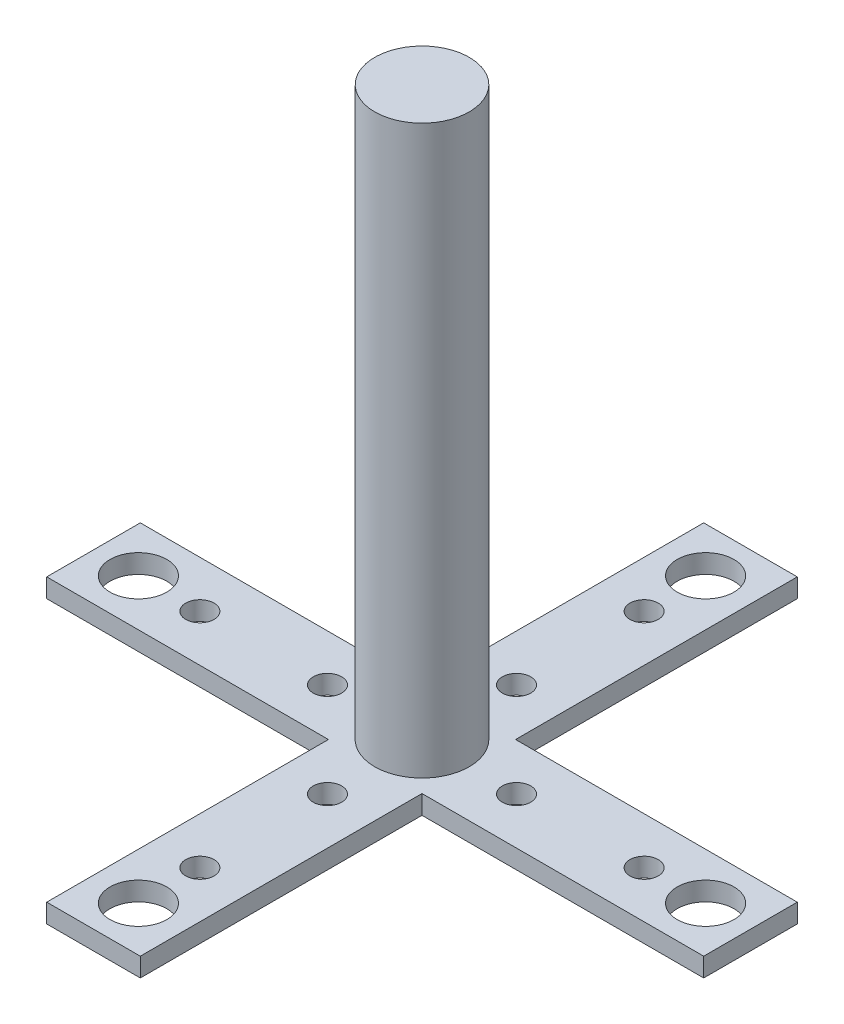
ISO-10303-21;
HEADER;
FILE_DESCRIPTION(('STEP AP214'),'2;1');
FILE_NAME('part.step','',(''),(''),'','','');
FILE_SCHEMA(('AUTOMOTIVE_DESIGN { 1 0 10303 214 1 1 1 1 }'));
ENDSEC;
DATA;
#1=APPLICATION_CONTEXT('core data for automotive mechanical design processes');
#2=APPLICATION_PROTOCOL_DEFINITION('international standard','automotive_design',2000,#1);
#3=PRODUCT_CONTEXT('',#1,'mechanical');
#4=PRODUCT('Part','Part','',(#3));
#5=PRODUCT_RELATED_PRODUCT_CATEGORY('part','',(#4));
#6=PRODUCT_DEFINITION_FORMATION('','',#4);
#7=PRODUCT_DEFINITION_CONTEXT('part definition',#1,'design');
#8=PRODUCT_DEFINITION('design','',#6,#7);
#9=PRODUCT_DEFINITION_SHAPE('','',#8);
#10=(LENGTH_UNIT() NAMED_UNIT(*) SI_UNIT(.MILLI.,.METRE.));
#11=(NAMED_UNIT(*) PLANE_ANGLE_UNIT() SI_UNIT($,.RADIAN.));
#12=(NAMED_UNIT(*) SI_UNIT($,.STERADIAN.) SOLID_ANGLE_UNIT());
#13=UNCERTAINTY_MEASURE_WITH_UNIT(LENGTH_MEASURE(1.E-05),#10,'distance_accuracy_value','');
#14=(GEOMETRIC_REPRESENTATION_CONTEXT(3) GLOBAL_UNCERTAINTY_ASSIGNED_CONTEXT((#13)) GLOBAL_UNIT_ASSIGNED_CONTEXT((#10,
#11,#12)) REPRESENTATION_CONTEXT('',''));
#15=CARTESIAN_POINT('',(0.,0.,0.));
#16=DIRECTION('',(0.,0.,1.));
#17=DIRECTION('',(1.,0.,0.));
#18=AXIS2_PLACEMENT_3D('',#15,#16,#17);
#19=CARTESIAN_POINT('',(0.,0.,0.));
#20=DIRECTION('',(0.,1.,0.));
#21=DIRECTION('',(0.,0.,1.));
#22=AXIS2_PLACEMENT_3D('',#19,#20,#21);
#23=PLANE('',#22);
#24=CARTESIAN_POINT('',(0.,0.,-30.));
#25=DIRECTION('',(0.,-1.,0.));
#26=DIRECTION('',(0.,0.,-1.));
#27=AXIS2_PLACEMENT_3D('',#24,#25,#26);
#28=CIRCLE('',#27,3.);
#29=CARTESIAN_POINT('',(0.,0.,-33.));
#30=VERTEX_POINT('',#29);
#31=EDGE_CURVE('E355',#30,#30,#28,.T.);
#32=ORIENTED_EDGE('',*,*,#31,.F.);
#33=EDGE_LOOP('',(#32));
#34=FACE_BOUND('',#33,.T.);
#35=CARTESIAN_POINT('',(-30.,0.,1.02142354951329E-13));
#36=DIRECTION('',(0.,-1.,0.));
#37=DIRECTION('',(0.,0.,-1.));
#38=AXIS2_PLACEMENT_3D('',#35,#36,#37);
#39=CIRCLE('',#38,3.);
#40=CARTESIAN_POINT('',(-30.,0.,-2.9999999999999));
#41=VERTEX_POINT('',#40);
#42=EDGE_CURVE('E626',#41,#41,#39,.T.);
#43=ORIENTED_EDGE('',*,*,#42,.F.);
#44=EDGE_LOOP('',(#43));
#45=FACE_BOUND('',#44,.T.);
#46=CARTESIAN_POINT('',(2.06886795116623E-13,0.,30.));
#47=DIRECTION('',(0.,-1.,0.));
#48=DIRECTION('',(0.,0.,-1.));
#49=AXIS2_PLACEMENT_3D('',#46,#47,#48);
#50=CIRCLE('',#49,3.);
#51=CARTESIAN_POINT('',(2.06886795116623E-13,0.,27.));
#52=VERTEX_POINT('',#51);
#53=EDGE_CURVE('E630',#52,#52,#50,.T.);
#54=ORIENTED_EDGE('',*,*,#53,.F.);
#55=EDGE_LOOP('',(#54));
#56=FACE_BOUND('',#55,.T.);
#57=CARTESIAN_POINT('',(30.,0.,-3.11631235281917E-13));
#58=DIRECTION('',(0.,-1.,0.));
#59=DIRECTION('',(0.,0.,-1.));
#60=AXIS2_PLACEMENT_3D('',#57,#58,#59);
#61=CIRCLE('',#60,3.);
#62=CARTESIAN_POINT('',(30.,0.,-3.00000000000031));
#63=VERTEX_POINT('',#62);
#64=EDGE_CURVE('E634',#63,#63,#61,.T.);
#65=ORIENTED_EDGE('',*,*,#64,.F.);
#66=EDGE_LOOP('',(#65));
#67=FACE_BOUND('',#66,.T.);
#68=CARTESIAN_POINT('',(-23.5,0.,-2.49454658759419E-13));
#69=DIRECTION('',(0.,1.,0.));
#70=DIRECTION('',(0.,0.,1.));
#71=AXIS2_PLACEMENT_3D('',#68,#69,#70);
#72=CIRCLE('',#71,1.5);
#73=CARTESIAN_POINT('',(-23.5,0.,1.49999999999975));
#74=VERTEX_POINT('',#73);
#75=EDGE_CURVE('E316',#74,#74,#72,.T.);
#76=ORIENTED_EDGE('',*,*,#75,.T.);
#77=EDGE_LOOP('',(#76));
#78=FACE_BOUND('',#77,.T.);
#79=CARTESIAN_POINT('',(-9.99999999997669,0.,1.4106110275037E-11));
#80=DIRECTION('',(0.,1.,0.));
#81=DIRECTION('',(0.,0.,1.));
#82=AXIS2_PLACEMENT_3D('',#79,#80,#81);
#83=CIRCLE('',#82,1.5);
#84=CARTESIAN_POINT('',(-9.99999999997669,0.,1.50000000001411));
#85=VERTEX_POINT('',#84);
#86=EDGE_CURVE('E312',#85,#85,#83,.T.);
#87=ORIENTED_EDGE('',*,*,#86,.T.);
#88=EDGE_LOOP('',(#87));
#89=FACE_BOUND('',#88,.T.);
#90=CARTESIAN_POINT('',(-1.67404847296605E-13,0.,23.5));
#91=DIRECTION('',(0.,1.,0.));
#92=DIRECTION('',(0.,0.,1.));
#93=AXIS2_PLACEMENT_3D('',#90,#91,#92);
#94=CIRCLE('',#93,1.5);
#95=CARTESIAN_POINT('',(-1.67404847296605E-13,0.,25.));
#96=VERTEX_POINT('',#95);
#97=EDGE_CURVE('E308',#96,#96,#94,.T.);
#98=ORIENTED_EDGE('',*,*,#97,.T.);
#99=EDGE_LOOP('',(#98));
#100=FACE_BOUND('',#99,.T.);
#101=CARTESIAN_POINT('',(1.41410250884253E-11,0.,9.99999999997669));
#102=DIRECTION('',(0.,1.,0.));
#103=DIRECTION('',(0.,0.,1.));
#104=AXIS2_PLACEMENT_3D('',#101,#102,#103);
#105=CIRCLE('',#104,1.5);
#106=CARTESIAN_POINT('',(1.41410250884253E-11,0.,11.4999999999767));
#107=VERTEX_POINT('',#106);
#108=EDGE_CURVE('E304',#107,#107,#105,.T.);
#109=ORIENTED_EDGE('',*,*,#108,.T.);
#110=EDGE_LOOP('',(#109));
#111=FACE_BOUND('',#110,.T.);
#112=CARTESIAN_POINT('',(-1.4210854715202E-11,0.,-9.99999999997669));
#113=DIRECTION('',(0.,1.,0.));
#114=DIRECTION('',(0.,0.,1.));
#115=AXIS2_PLACEMENT_3D('',#112,#113,#114);
#116=CIRCLE('',#115,1.5);
#117=CARTESIAN_POINT('',(-1.4210854715202E-11,0.,-8.49999999997669));
#118=VERTEX_POINT('',#117);
#119=EDGE_CURVE('E300',#118,#118,#116,.T.);
#120=ORIENTED_EDGE('',*,*,#119,.T.);
#121=EDGE_LOOP('',(#120));
#122=FACE_BOUND('',#121,.T.);
#123=CARTESIAN_POINT('',(0.,0.,-23.5));
#124=DIRECTION('',(0.,1.,0.));
#125=DIRECTION('',(0.,0.,1.));
#126=AXIS2_PLACEMENT_3D('',#123,#124,#125);
#127=CIRCLE('',#126,1.5);
#128=CARTESIAN_POINT('',(0.,0.,-22.));
#129=VERTEX_POINT('',#128);
#130=EDGE_CURVE('E296',#129,#129,#127,.T.);
#131=ORIENTED_EDGE('',*,*,#130,.T.);
#132=EDGE_LOOP('',(#131));
#133=FACE_BOUND('',#132,.T.);
#134=CARTESIAN_POINT('',(23.5,0.,0.));
#135=DIRECTION('',(0.,1.,0.));
#136=DIRECTION('',(0.,0.,1.));
#137=AXIS2_PLACEMENT_3D('',#134,#135,#136);
#138=CIRCLE('',#137,1.5);
#139=CARTESIAN_POINT('',(23.5,0.,1.50000000000009));
#140=VERTEX_POINT('',#139);
#141=EDGE_CURVE('E292',#140,#140,#138,.T.);
#142=ORIENTED_EDGE('',*,*,#141,.T.);
#143=EDGE_LOOP('',(#142));
#144=FACE_BOUND('',#143,.T.);
#145=CARTESIAN_POINT('',(9.99999999997669,0.,-1.41759399018137E-11));
#146=DIRECTION('',(0.,1.,0.));
#147=DIRECTION('',(0.,0.,1.));
#148=AXIS2_PLACEMENT_3D('',#145,#146,#147);
#149=CIRCLE('',#148,1.5);
#150=CARTESIAN_POINT('',(9.99999999997669,0.,1.49999999998582));
#151=VERTEX_POINT('',#150);
#152=EDGE_CURVE('E288',#151,#151,#149,.T.);
#153=ORIENTED_EDGE('',*,*,#152,.T.);
#154=EDGE_LOOP('',(#153));
#155=FACE_BOUND('',#154,.T.);
#156=DIRECTION('',(0.,0.,-1.));
#157=VECTOR('',#156,1.);
#158=CARTESIAN_POINT('',(-4.94999999999999,0.,0.));
#159=LINE('',#158,#157);
#160=CARTESIAN_POINT('',(-4.94999999999999,0.,-4.95));
#161=VERTEX_POINT('',#160);
#162=CARTESIAN_POINT('',(-4.94999999999999,0.,-34.75));
#163=VERTEX_POINT('',#162);
#164=EDGE_CURVE('E243',#161,#163,#159,.T.);
#165=ORIENTED_EDGE('',*,*,#164,.T.);
#166=DIRECTION('',(1.,0.,0.));
#167=VECTOR('',#166,1.);
#168=CARTESIAN_POINT('',(0.,0.,-34.75));
#169=LINE('',#168,#167);
#170=CARTESIAN_POINT('',(4.95000000000001,0.,-34.75));
#171=VERTEX_POINT('',#170);
#172=EDGE_CURVE('E284',#163,#171,#169,.T.);
#173=ORIENTED_EDGE('',*,*,#172,.T.);
#174=DIRECTION('',(0.,0.,-1.));
#175=VECTOR('',#174,1.);
#176=CARTESIAN_POINT('',(4.95000000000001,0.,0.));
#177=LINE('',#176,#175);
#178=CARTESIAN_POINT('',(4.95000000000001,0.,-4.95));
#179=VERTEX_POINT('',#178);
#180=EDGE_CURVE('E281',#179,#171,#177,.T.);
#181=ORIENTED_EDGE('',*,*,#180,.F.);
#182=DIRECTION('',(1.,0.,0.));
#183=VECTOR('',#182,1.);
#184=CARTESIAN_POINT('',(0.,0.,-4.95));
#185=LINE('',#184,#183);
#186=CARTESIAN_POINT('',(34.75,0.,-4.95));
#187=VERTEX_POINT('',#186);
#188=EDGE_CURVE('E184',#179,#187,#185,.T.);
#189=ORIENTED_EDGE('',*,*,#188,.T.);
#190=DIRECTION('',(0.,0.,-1.));
#191=VECTOR('',#190,1.);
#192=CARTESIAN_POINT('',(34.75,0.,0.));
#193=LINE('',#192,#191);
#194=CARTESIAN_POINT('',(34.75,0.,4.95));
#195=VERTEX_POINT('',#194);
#196=EDGE_CURVE('E275',#195,#187,#193,.T.);
#197=ORIENTED_EDGE('',*,*,#196,.F.);
#198=DIRECTION('',(1.,0.,0.));
#199=VECTOR('',#198,1.);
#200=CARTESIAN_POINT('',(0.,0.,4.95));
#201=LINE('',#200,#199);
#202=CARTESIAN_POINT('',(4.95000000000001,0.,4.95));
#203=VERTEX_POINT('',#202);
#204=EDGE_CURVE('E271',#203,#195,#201,.T.);
#205=ORIENTED_EDGE('',*,*,#204,.F.);
#206=DIRECTION('',(0.,0.,-1.));
#207=VECTOR('',#206,1.);
#208=CARTESIAN_POINT('',(4.95000000000001,0.,0.));
#209=LINE('',#208,#207);
#210=CARTESIAN_POINT('',(4.95000000000001,0.,34.75));
#211=VERTEX_POINT('',#210);
#212=EDGE_CURVE('E267',#211,#203,#209,.T.);
#213=ORIENTED_EDGE('',*,*,#212,.F.);
#214=DIRECTION('',(1.,0.,0.));
#215=VECTOR('',#214,1.);
#216=CARTESIAN_POINT('',(0.,0.,34.75));
#217=LINE('',#216,#215);
#218=CARTESIAN_POINT('',(-4.94999999999999,0.,34.75));
#219=VERTEX_POINT('',#218);
#220=EDGE_CURVE('E263',#219,#211,#217,.T.);
#221=ORIENTED_EDGE('',*,*,#220,.F.);
#222=DIRECTION('',(0.,0.,-1.));
#223=VECTOR('',#222,1.);
#224=CARTESIAN_POINT('',(-4.94999999999999,0.,0.));
#225=LINE('',#224,#223);
#226=CARTESIAN_POINT('',(-4.94999999999999,0.,4.95));
#227=VERTEX_POINT('',#226);
#228=EDGE_CURVE('E259',#219,#227,#225,.T.);
#229=ORIENTED_EDGE('',*,*,#228,.T.);
#230=DIRECTION('',(1.,0.,0.));
#231=VECTOR('',#230,1.);
#232=CARTESIAN_POINT('',(0.,0.,4.95));
#233=LINE('',#232,#231);
#234=CARTESIAN_POINT('',(-34.75,0.,4.95));
#235=VERTEX_POINT('',#234);
#236=EDGE_CURVE('E255',#235,#227,#233,.T.);
#237=ORIENTED_EDGE('',*,*,#236,.F.);
#238=DIRECTION('',(0.,0.,-1.));
#239=VECTOR('',#238,1.);
#240=CARTESIAN_POINT('',(-34.75,0.,0.));
#241=LINE('',#240,#239);
#242=CARTESIAN_POINT('',(-34.75,0.,-4.95));
#243=VERTEX_POINT('',#242);
#244=EDGE_CURVE('E251',#235,#243,#241,.T.);
#245=ORIENTED_EDGE('',*,*,#244,.T.);
#246=DIRECTION('',(1.,0.,0.));
#247=VECTOR('',#246,1.);
#248=CARTESIAN_POINT('',(0.,0.,-4.95));
#249=LINE('',#248,#247);
#250=EDGE_CURVE('E246',#243,#161,#249,.T.);
#251=ORIENTED_EDGE('',*,*,#250,.T.);
#252=EDGE_LOOP('',(#165,#173,#181,#189,#197,#205,#213,#221,#229,#237,#245,#251));
#253=FACE_BOUND('',#252,.T.);
#254=ADVANCED_FACE('F83',(#34,#45,#56,#67,#78,#89,#100,#111,#122,#133,#144,#155,#253),#23,.F.);
#255=CARTESIAN_POINT('',(0.,2.,0.));
#256=DIRECTION('',(0.,1.,0.));
#257=DIRECTION('',(0.,0.,1.));
#258=AXIS2_PLACEMENT_3D('',#255,#256,#257);
#259=PLANE('',#258);
#260=CARTESIAN_POINT('',(0.,2.,-30.));
#261=DIRECTION('',(0.,1.,0.));
#262=DIRECTION('',(0.,0.,1.));
#263=AXIS2_PLACEMENT_3D('',#260,#261,#262);
#264=CIRCLE('',#263,3.);
#265=CARTESIAN_POINT('',(0.,2.,-27.));
#266=VERTEX_POINT('',#265);
#267=EDGE_CURVE('E87',#266,#266,#264,.T.);
#268=ORIENTED_EDGE('',*,*,#267,.F.);
#269=EDGE_LOOP('',(#268));
#270=FACE_BOUND('',#269,.T.);
#271=CARTESIAN_POINT('',(-30.,2.,1.02142354951329E-13));
#272=DIRECTION('',(0.,1.,0.));
#273=DIRECTION('',(0.,0.,1.));
#274=AXIS2_PLACEMENT_3D('',#271,#272,#273);
#275=CIRCLE('',#274,3.);
#276=CARTESIAN_POINT('',(-30.,2.,3.0000000000001));
#277=VERTEX_POINT('',#276);
#278=EDGE_CURVE('E358',#277,#277,#275,.T.);
#279=ORIENTED_EDGE('',*,*,#278,.F.);
#280=EDGE_LOOP('',(#279));
#281=FACE_BOUND('',#280,.T.);
#282=CARTESIAN_POINT('',(2.06886795116623E-13,2.,30.));
#283=DIRECTION('',(0.,1.,0.));
#284=DIRECTION('',(0.,0.,1.));
#285=AXIS2_PLACEMENT_3D('',#282,#283,#284);
#286=CIRCLE('',#285,3.);
#287=CARTESIAN_POINT('',(2.06886795116623E-13,2.,33.));
#288=VERTEX_POINT('',#287);
#289=EDGE_CURVE('E354',#288,#288,#286,.T.);
#290=ORIENTED_EDGE('',*,*,#289,.F.);
#291=EDGE_LOOP('',(#290));
#292=FACE_BOUND('',#291,.T.);
#293=CARTESIAN_POINT('',(30.,2.,-3.11631235281917E-13));
#294=DIRECTION('',(0.,1.,0.));
#295=DIRECTION('',(0.,0.,1.));
#296=AXIS2_PLACEMENT_3D('',#293,#294,#295);
#297=CIRCLE('',#296,3.);
#298=CARTESIAN_POINT('',(30.,2.,2.99999999999969));
#299=VERTEX_POINT('',#298);
#300=EDGE_CURVE('E350',#299,#299,#297,.T.);
#301=ORIENTED_EDGE('',*,*,#300,.F.);
#302=EDGE_LOOP('',(#301));
#303=FACE_BOUND('',#302,.T.);
#304=CARTESIAN_POINT('',(0.,2.,0.));
#305=DIRECTION('',(0.,1.,0.));
#306=DIRECTION('',(0.,0.,1.));
#307=AXIS2_PLACEMENT_3D('',#304,#305,#306);
#308=CIRCLE('',#307,5.);
#309=CARTESIAN_POINT('',(0.,2.,5.));
#310=VERTEX_POINT('',#309);
#311=EDGE_CURVE('E365',#310,#310,#308,.T.);
#312=ORIENTED_EDGE('',*,*,#311,.F.);
#313=EDGE_LOOP('',(#312));
#314=FACE_BOUND('',#313,.T.);
#315=DIRECTION('',(0.,0.,-1.));
#316=VECTOR('',#315,1.);
#317=CARTESIAN_POINT('',(-4.94999999999999,2.,0.));
#318=LINE('',#317,#316);
#319=CARTESIAN_POINT('',(-4.94999999999999,2.,-4.95));
#320=VERTEX_POINT('',#319);
#321=CARTESIAN_POINT('',(-4.94999999999999,2.,-34.75));
#322=VERTEX_POINT('',#321);
#323=EDGE_CURVE('E320',#320,#322,#318,.T.);
#324=ORIENTED_EDGE('',*,*,#323,.F.);
#325=DIRECTION('',(1.,0.,0.));
#326=VECTOR('',#325,1.);
#327=CARTESIAN_POINT('',(0.,2.,-4.95));
#328=LINE('',#327,#326);
#329=CARTESIAN_POINT('',(-34.75,2.,-4.95));
#330=VERTEX_POINT('',#329);
#331=EDGE_CURVE('E380',#330,#320,#328,.T.);
#332=ORIENTED_EDGE('',*,*,#331,.F.);
#333=DIRECTION('',(0.,0.,-1.));
#334=VECTOR('',#333,1.);
#335=CARTESIAN_POINT('',(-34.75,2.,0.));
#336=LINE('',#335,#334);
#337=CARTESIAN_POINT('',(-34.75,2.,4.95));
#338=VERTEX_POINT('',#337);
#339=EDGE_CURVE('E384',#338,#330,#336,.T.);
#340=ORIENTED_EDGE('',*,*,#339,.F.);
#341=DIRECTION('',(1.,0.,0.));
#342=VECTOR('',#341,1.);
#343=CARTESIAN_POINT('',(0.,2.,4.95));
#344=LINE('',#343,#342);
#345=CARTESIAN_POINT('',(-4.94999999999999,2.,4.95));
#346=VERTEX_POINT('',#345);
#347=EDGE_CURVE('E388',#338,#346,#344,.T.);
#348=ORIENTED_EDGE('',*,*,#347,.T.);
#349=DIRECTION('',(0.,0.,-1.));
#350=VECTOR('',#349,1.);
#351=CARTESIAN_POINT('',(-4.94999999999999,2.,0.));
#352=LINE('',#351,#350);
#353=CARTESIAN_POINT('',(-4.94999999999999,2.,34.75));
#354=VERTEX_POINT('',#353);
#355=EDGE_CURVE('E391',#354,#346,#352,.T.);
#356=ORIENTED_EDGE('',*,*,#355,.F.);
#357=DIRECTION('',(1.,0.,0.));
#358=VECTOR('',#357,1.);
#359=CARTESIAN_POINT('',(0.,2.,34.75));
#360=LINE('',#359,#358);
#361=CARTESIAN_POINT('',(4.95000000000001,2.,34.75));
#362=VERTEX_POINT('',#361);
#363=EDGE_CURVE('E395',#354,#362,#360,.T.);
#364=ORIENTED_EDGE('',*,*,#363,.T.);
#365=DIRECTION('',(0.,0.,-1.));
#366=VECTOR('',#365,1.);
#367=CARTESIAN_POINT('',(4.95000000000001,2.,0.));
#368=LINE('',#367,#366);
#369=CARTESIAN_POINT('',(4.95000000000001,2.,4.95));
#370=VERTEX_POINT('',#369);
#371=EDGE_CURVE('E399',#362,#370,#368,.T.);
#372=ORIENTED_EDGE('',*,*,#371,.T.);
#373=DIRECTION('',(1.,0.,0.));
#374=VECTOR('',#373,1.);
#375=CARTESIAN_POINT('',(0.,2.,4.95));
#376=LINE('',#375,#374);
#377=CARTESIAN_POINT('',(34.75,2.,4.95));
#378=VERTEX_POINT('',#377);
#379=EDGE_CURVE('E205',#370,#378,#376,.T.);
#380=ORIENTED_EDGE('',*,*,#379,.T.);
#381=DIRECTION('',(0.,0.,-1.));
#382=VECTOR('',#381,1.);
#383=CARTESIAN_POINT('',(34.75,2.,0.));
#384=LINE('',#383,#382);
#385=CARTESIAN_POINT('',(34.75,2.,-4.95));
#386=VERTEX_POINT('',#385);
#387=EDGE_CURVE('E200',#378,#386,#384,.T.);
#388=ORIENTED_EDGE('',*,*,#387,.T.);
#389=DIRECTION('',(1.,0.,0.));
#390=VECTOR('',#389,1.);
#391=CARTESIAN_POINT('',(0.,2.,-4.95));
#392=LINE('',#391,#390);
#393=CARTESIAN_POINT('',(4.95000000000001,2.,-4.95));
#394=VERTEX_POINT('',#393);
#395=EDGE_CURVE('E182',#394,#386,#392,.T.);
#396=ORIENTED_EDGE('',*,*,#395,.F.);
#397=DIRECTION('',(0.,0.,-1.));
#398=VECTOR('',#397,1.);
#399=CARTESIAN_POINT('',(4.95000000000001,2.,0.));
#400=LINE('',#399,#398);
#401=CARTESIAN_POINT('',(4.95000000000001,2.,-34.75));
#402=VERTEX_POINT('',#401);
#403=EDGE_CURVE('E190',#394,#402,#400,.T.);
#404=ORIENTED_EDGE('',*,*,#403,.T.);
#405=DIRECTION('',(1.,0.,0.));
#406=VECTOR('',#405,1.);
#407=CARTESIAN_POINT('',(0.,2.,-34.75));
#408=LINE('',#407,#406);
#409=EDGE_CURVE('E195',#322,#402,#408,.T.);
#410=ORIENTED_EDGE('',*,*,#409,.F.);
#411=EDGE_LOOP('',(#324,#332,#340,#348,#356,#364,#372,#380,#388,#396,#404,#410));
#412=FACE_BOUND('',#411,.T.);
#413=CARTESIAN_POINT('',(9.99999999997669,2.,-1.41759399018137E-11));
#414=DIRECTION('',(0.,1.,0.));
#415=DIRECTION('',(0.,0.,1.));
#416=AXIS2_PLACEMENT_3D('',#413,#414,#415);
#417=CIRCLE('',#416,1.5);
#418=CARTESIAN_POINT('',(9.99999999997669,2.,1.49999999998582));
#419=VERTEX_POINT('',#418);
#420=EDGE_CURVE('E211',#419,#419,#417,.T.);
#421=ORIENTED_EDGE('',*,*,#420,.F.);
#422=EDGE_LOOP('',(#421));
#423=FACE_BOUND('',#422,.T.);
#424=CARTESIAN_POINT('',(23.5,2.,0.));
#425=DIRECTION('',(0.,1.,0.));
#426=DIRECTION('',(0.,0.,1.));
#427=AXIS2_PLACEMENT_3D('',#424,#425,#426);
#428=CIRCLE('',#427,1.5);
#429=CARTESIAN_POINT('',(23.5,2.,1.50000000000009));
#430=VERTEX_POINT('',#429);
#431=EDGE_CURVE('E215',#430,#430,#428,.T.);
#432=ORIENTED_EDGE('',*,*,#431,.F.);
#433=EDGE_LOOP('',(#432));
#434=FACE_BOUND('',#433,.T.);
#435=CARTESIAN_POINT('',(0.,2.,-23.5));
#436=DIRECTION('',(0.,1.,0.));
#437=DIRECTION('',(0.,0.,1.));
#438=AXIS2_PLACEMENT_3D('',#435,#436,#437);
#439=CIRCLE('',#438,1.5);
#440=CARTESIAN_POINT('',(0.,2.,-22.));
#441=VERTEX_POINT('',#440);
#442=EDGE_CURVE('E219',#441,#441,#439,.T.);
#443=ORIENTED_EDGE('',*,*,#442,.F.);
#444=EDGE_LOOP('',(#443));
#445=FACE_BOUND('',#444,.T.);
#446=CARTESIAN_POINT('',(-1.4210854715202E-11,2.,-9.99999999997669));
#447=DIRECTION('',(0.,1.,0.));
#448=DIRECTION('',(0.,0.,1.));
#449=AXIS2_PLACEMENT_3D('',#446,#447,#448);
#450=CIRCLE('',#449,1.5);
#451=CARTESIAN_POINT('',(-1.4210854715202E-11,2.,-8.49999999997669));
#452=VERTEX_POINT('',#451);
#453=EDGE_CURVE('E223',#452,#452,#450,.T.);
#454=ORIENTED_EDGE('',*,*,#453,.F.);
#455=EDGE_LOOP('',(#454));
#456=FACE_BOUND('',#455,.T.);
#457=CARTESIAN_POINT('',(1.41410250884253E-11,2.,9.99999999997669));
#458=DIRECTION('',(0.,1.,0.));
#459=DIRECTION('',(0.,0.,1.));
#460=AXIS2_PLACEMENT_3D('',#457,#458,#459);
#461=CIRCLE('',#460,1.5);
#462=CARTESIAN_POINT('',(1.41410250884253E-11,2.,11.4999999999767));
#463=VERTEX_POINT('',#462);
#464=EDGE_CURVE('E227',#463,#463,#461,.T.);
#465=ORIENTED_EDGE('',*,*,#464,.F.);
#466=EDGE_LOOP('',(#465));
#467=FACE_BOUND('',#466,.T.);
#468=CARTESIAN_POINT('',(-1.67404847296605E-13,2.,23.5));
#469=DIRECTION('',(0.,1.,0.));
#470=DIRECTION('',(0.,0.,1.));
#471=AXIS2_PLACEMENT_3D('',#468,#469,#470);
#472=CIRCLE('',#471,1.5);
#473=CARTESIAN_POINT('',(-1.67404847296605E-13,2.,25.));
#474=VERTEX_POINT('',#473);
#475=EDGE_CURVE('E231',#474,#474,#472,.T.);
#476=ORIENTED_EDGE('',*,*,#475,.F.);
#477=EDGE_LOOP('',(#476));
#478=FACE_BOUND('',#477,.T.);
#479=CARTESIAN_POINT('',(-9.99999999997669,2.,1.4106110275037E-11));
#480=DIRECTION('',(0.,1.,0.));
#481=DIRECTION('',(0.,0.,1.));
#482=AXIS2_PLACEMENT_3D('',#479,#480,#481);
#483=CIRCLE('',#482,1.5);
#484=CARTESIAN_POINT('',(-9.99999999997669,2.,1.50000000001411));
#485=VERTEX_POINT('',#484);
#486=EDGE_CURVE('E235',#485,#485,#483,.T.);
#487=ORIENTED_EDGE('',*,*,#486,.F.);
#488=EDGE_LOOP('',(#487));
#489=FACE_BOUND('',#488,.T.);
#490=CARTESIAN_POINT('',(-23.5,2.,-2.49454658759419E-13));
#491=DIRECTION('',(0.,1.,0.));
#492=DIRECTION('',(0.,0.,1.));
#493=AXIS2_PLACEMENT_3D('',#490,#491,#492);
#494=CIRCLE('',#493,1.5);
#495=CARTESIAN_POINT('',(-23.5,2.,1.49999999999975));
#496=VERTEX_POINT('',#495);
#497=EDGE_CURVE('E239',#496,#496,#494,.T.);
#498=ORIENTED_EDGE('',*,*,#497,.F.);
#499=EDGE_LOOP('',(#498));
#500=FACE_BOUND('',#499,.T.);
#501=ADVANCED_FACE('F197',(#270,#281,#292,#303,#314,#412,#423,#434,#445,#456,#467,#478,#489,
#500),#259,.T.);
#502=CARTESIAN_POINT('',(0.,2.,-4.95));
#503=DIRECTION('',(0.,0.,-1.));
#504=DIRECTION('',(-1.,0.,0.));
#505=AXIS2_PLACEMENT_3D('',#502,#503,#504);
#506=PLANE('',#505);
#507=ORIENTED_EDGE('',*,*,#250,.F.);
#508=DIRECTION('',(0.,-1.,0.));
#509=VECTOR('',#508,1.);
#510=CARTESIAN_POINT('',(-34.75,2.,-4.95));
#511=LINE('',#510,#509);
#512=EDGE_CURVE('E94',#330,#243,#511,.T.);
#513=ORIENTED_EDGE('',*,*,#512,.F.);
#514=ORIENTED_EDGE('',*,*,#331,.T.);
#515=DIRECTION('',(0.,-1.,0.));
#516=VECTOR('',#515,1.);
#517=CARTESIAN_POINT('',(-4.94999999999999,2.,-4.95));
#518=LINE('',#517,#516);
#519=EDGE_CURVE('E12',#320,#161,#518,.T.);
#520=ORIENTED_EDGE('',*,*,#519,.T.);
#521=EDGE_LOOP('',(#507,#513,#514,#520));
#522=FACE_BOUND('',#521,.T.);
#523=ADVANCED_FACE('F420',(#522),#506,.T.);
#524=CARTESIAN_POINT('',(-34.75,2.,0.));
#525=DIRECTION('',(-1.,0.,0.));
#526=DIRECTION('',(0.,0.,1.));
#527=AXIS2_PLACEMENT_3D('',#524,#525,#526);
#528=PLANE('',#527);
#529=ORIENTED_EDGE('',*,*,#244,.F.);
#530=DIRECTION('',(0.,-1.,0.));
#531=VECTOR('',#530,1.);
#532=CARTESIAN_POINT('',(-34.75,2.,4.95));
#533=LINE('',#532,#531);
#534=EDGE_CURVE('E345',#338,#235,#533,.T.);
#535=ORIENTED_EDGE('',*,*,#534,.F.);
#536=ORIENTED_EDGE('',*,*,#339,.T.);
#537=ORIENTED_EDGE('',*,*,#512,.T.);
#538=EDGE_LOOP('',(#529,#535,#536,#537));
#539=FACE_BOUND('',#538,.T.);
#540=ADVANCED_FACE('F422',(#539),#528,.T.);
#541=CARTESIAN_POINT('',(0.,2.,4.95));
#542=DIRECTION('',(0.,0.,-1.));
#543=DIRECTION('',(-1.,0.,0.));
#544=AXIS2_PLACEMENT_3D('',#541,#542,#543);
#545=PLANE('',#544);
#546=ORIENTED_EDGE('',*,*,#236,.T.);
#547=DIRECTION('',(0.,-1.,0.));
#548=VECTOR('',#547,1.);
#549=CARTESIAN_POINT('',(-4.94999999999999,2.,4.95));
#550=LINE('',#549,#548);
#551=EDGE_CURVE('E342',#346,#227,#550,.T.);
#552=ORIENTED_EDGE('',*,*,#551,.F.);
#553=ORIENTED_EDGE('',*,*,#347,.F.);
#554=ORIENTED_EDGE('',*,*,#534,.T.);
#555=EDGE_LOOP('',(#546,#552,#553,#554));
#556=FACE_BOUND('',#555,.T.);
#557=ADVANCED_FACE('F427',(#556),#545,.F.);
#558=CARTESIAN_POINT('',(-4.94999999999999,2.,0.));
#559=DIRECTION('',(-1.,0.,0.));
#560=DIRECTION('',(0.,0.,1.));
#561=AXIS2_PLACEMENT_3D('',#558,#559,#560);
#562=PLANE('',#561);
#563=ORIENTED_EDGE('',*,*,#228,.F.);
#564=DIRECTION('',(0.,-1.,0.));
#565=VECTOR('',#564,1.);
#566=CARTESIAN_POINT('',(-4.94999999999999,2.,34.75));
#567=LINE('',#566,#565);
#568=EDGE_CURVE('E339',#354,#219,#567,.T.);
#569=ORIENTED_EDGE('',*,*,#568,.F.);
#570=ORIENTED_EDGE('',*,*,#355,.T.);
#571=ORIENTED_EDGE('',*,*,#551,.T.);
#572=EDGE_LOOP('',(#563,#569,#570,#571));
#573=FACE_BOUND('',#572,.T.);
#574=ADVANCED_FACE('F438',(#573),#562,.T.);
#575=CARTESIAN_POINT('',(0.,2.,34.75));
#576=DIRECTION('',(0.,0.,-1.));
#577=DIRECTION('',(-1.,0.,0.));
#578=AXIS2_PLACEMENT_3D('',#575,#576,#577);
#579=PLANE('',#578);
#580=ORIENTED_EDGE('',*,*,#220,.T.);
#581=DIRECTION('',(0.,-1.,0.));
#582=VECTOR('',#581,1.);
#583=CARTESIAN_POINT('',(4.95000000000001,2.,34.75));
#584=LINE('',#583,#582);
#585=EDGE_CURVE('E335',#362,#211,#584,.T.);
#586=ORIENTED_EDGE('',*,*,#585,.F.);
#587=ORIENTED_EDGE('',*,*,#363,.F.);
#588=ORIENTED_EDGE('',*,*,#568,.T.);
#589=EDGE_LOOP('',(#580,#586,#587,#588));
#590=FACE_BOUND('',#589,.T.);
#591=ADVANCED_FACE('F442',(#590),#579,.F.);
#592=CARTESIAN_POINT('',(4.95000000000001,2.,0.));
#593=DIRECTION('',(-1.,0.,0.));
#594=DIRECTION('',(0.,0.,1.));
#595=AXIS2_PLACEMENT_3D('',#592,#593,#594);
#596=PLANE('',#595);
#597=ORIENTED_EDGE('',*,*,#212,.T.);
#598=DIRECTION('',(0.,-1.,0.));
#599=VECTOR('',#598,1.);
#600=CARTESIAN_POINT('',(4.95000000000001,2.,4.95));
#601=LINE('',#600,#599);
#602=EDGE_CURVE('E331',#370,#203,#601,.T.);
#603=ORIENTED_EDGE('',*,*,#602,.F.);
#604=ORIENTED_EDGE('',*,*,#371,.F.);
#605=ORIENTED_EDGE('',*,*,#585,.T.);
#606=EDGE_LOOP('',(#597,#603,#604,#605));
#607=FACE_BOUND('',#606,.T.);
#608=ADVANCED_FACE('F446',(#607),#596,.F.);
#609=CARTESIAN_POINT('',(0.,2.,4.95));
#610=DIRECTION('',(0.,0.,-1.));
#611=DIRECTION('',(-1.,0.,0.));
#612=AXIS2_PLACEMENT_3D('',#609,#610,#611);
#613=PLANE('',#612);
#614=ORIENTED_EDGE('',*,*,#204,.T.);
#615=DIRECTION('',(0.,-1.,0.));
#616=VECTOR('',#615,1.);
#617=CARTESIAN_POINT('',(34.75,2.,4.95));
#618=LINE('',#617,#616);
#619=EDGE_CURVE('E327',#378,#195,#618,.T.);
#620=ORIENTED_EDGE('',*,*,#619,.F.);
#621=ORIENTED_EDGE('',*,*,#379,.F.);
#622=ORIENTED_EDGE('',*,*,#602,.T.);
#623=EDGE_LOOP('',(#614,#620,#621,#622));
#624=FACE_BOUND('',#623,.T.);
#625=ADVANCED_FACE('F406',(#624),#613,.F.);
#626=CARTESIAN_POINT('',(34.75,2.,0.));
#627=DIRECTION('',(-1.,0.,0.));
#628=DIRECTION('',(0.,0.,1.));
#629=AXIS2_PLACEMENT_3D('',#626,#627,#628);
#630=PLANE('',#629);
#631=ORIENTED_EDGE('',*,*,#196,.T.);
#632=DIRECTION('',(0.,-1.,0.));
#633=VECTOR('',#632,1.);
#634=CARTESIAN_POINT('',(34.75,2.,-4.95));
#635=LINE('',#634,#633);
#636=EDGE_CURVE('E188',#386,#187,#635,.T.);
#637=ORIENTED_EDGE('',*,*,#636,.F.);
#638=ORIENTED_EDGE('',*,*,#387,.F.);
#639=ORIENTED_EDGE('',*,*,#619,.T.);
#640=EDGE_LOOP('',(#631,#637,#638,#639));
#641=FACE_BOUND('',#640,.T.);
#642=ADVANCED_FACE('F408',(#641),#630,.F.);
#643=CARTESIAN_POINT('',(0.,2.,-4.95));
#644=DIRECTION('',(0.,0.,-1.));
#645=DIRECTION('',(-1.,0.,0.));
#646=AXIS2_PLACEMENT_3D('',#643,#644,#645);
#647=PLANE('',#646);
#648=ORIENTED_EDGE('',*,*,#188,.F.);
#649=DIRECTION('',(0.,-1.,0.));
#650=VECTOR('',#649,1.);
#651=CARTESIAN_POINT('',(4.95000000000001,2.,-4.95));
#652=LINE('',#651,#650);
#653=EDGE_CURVE('E178',#394,#179,#652,.T.);
#654=ORIENTED_EDGE('',*,*,#653,.F.);
#655=ORIENTED_EDGE('',*,*,#395,.T.);
#656=ORIENTED_EDGE('',*,*,#636,.T.);
#657=EDGE_LOOP('',(#648,#654,#655,#656));
#658=FACE_BOUND('',#657,.T.);
#659=ADVANCED_FACE('F180',(#658),#647,.T.);
#660=CARTESIAN_POINT('',(4.95000000000001,2.,0.));
#661=DIRECTION('',(-1.,0.,0.));
#662=DIRECTION('',(0.,0.,1.));
#663=AXIS2_PLACEMENT_3D('',#660,#661,#662);
#664=PLANE('',#663);
#665=ORIENTED_EDGE('',*,*,#180,.T.);
#666=DIRECTION('',(0.,-1.,0.));
#667=VECTOR('',#666,1.);
#668=CARTESIAN_POINT('',(4.95000000000001,2.,-34.75));
#669=LINE('',#668,#667);
#670=EDGE_CURVE('E141',#402,#171,#669,.T.);
#671=ORIENTED_EDGE('',*,*,#670,.F.);
#672=ORIENTED_EDGE('',*,*,#403,.F.);
#673=ORIENTED_EDGE('',*,*,#653,.T.);
#674=EDGE_LOOP('',(#665,#671,#672,#673));
#675=FACE_BOUND('',#674,.T.);
#676=ADVANCED_FACE('F191',(#675),#664,.F.);
#677=CARTESIAN_POINT('',(0.,2.,-34.75));
#678=DIRECTION('',(0.,0.,-1.));
#679=DIRECTION('',(-1.,0.,0.));
#680=AXIS2_PLACEMENT_3D('',#677,#678,#679);
#681=PLANE('',#680);
#682=ORIENTED_EDGE('',*,*,#172,.F.);
#683=DIRECTION('',(0.,-1.,0.));
#684=VECTOR('',#683,1.);
#685=CARTESIAN_POINT('',(-4.94999999999999,2.,-34.75));
#686=LINE('',#685,#684);
#687=EDGE_CURVE('E103',#322,#163,#686,.T.);
#688=ORIENTED_EDGE('',*,*,#687,.F.);
#689=ORIENTED_EDGE('',*,*,#409,.T.);
#690=ORIENTED_EDGE('',*,*,#670,.T.);
#691=EDGE_LOOP('',(#682,#688,#689,#690));
#692=FACE_BOUND('',#691,.T.);
#693=ADVANCED_FACE('F410',(#692),#681,.T.);
#694=CARTESIAN_POINT('',(-4.94999999999999,2.,0.));
#695=DIRECTION('',(-1.,0.,0.));
#696=DIRECTION('',(0.,0.,1.));
#697=AXIS2_PLACEMENT_3D('',#694,#695,#696);
#698=PLANE('',#697);
#699=ORIENTED_EDGE('',*,*,#164,.F.);
#700=ORIENTED_EDGE('',*,*,#519,.F.);
#701=ORIENTED_EDGE('',*,*,#323,.T.);
#702=ORIENTED_EDGE('',*,*,#687,.T.);
#703=EDGE_LOOP('',(#699,#700,#701,#702));
#704=FACE_BOUND('',#703,.T.);
#705=ADVANCED_FACE('F85',(#704),#698,.T.);
#706=CARTESIAN_POINT('',(9.99999999997669,2.,-1.41759399018137E-11));
#707=DIRECTION('',(0.,-1.,0.));
#708=DIRECTION('',(0.,0.,-1.));
#709=AXIS2_PLACEMENT_3D('',#706,#707,#708);
#710=CYLINDRICAL_SURFACE('',#709,1.5);
#711=ORIENTED_EDGE('',*,*,#420,.T.);
#712=EDGE_LOOP('',(#711));
#713=FACE_BOUND('',#712,.T.);
#714=ORIENTED_EDGE('',*,*,#152,.F.);
#715=EDGE_LOOP('',(#714));
#716=FACE_BOUND('',#715,.T.);
#717=ADVANCED_FACE('F417',(#713,#716),#710,.F.);
#718=CARTESIAN_POINT('',(23.5,2.,0.));
#719=DIRECTION('',(0.,-1.,0.));
#720=DIRECTION('',(0.,0.,-1.));
#721=AXIS2_PLACEMENT_3D('',#718,#719,#720);
#722=CYLINDRICAL_SURFACE('',#721,1.5);
#723=ORIENTED_EDGE('',*,*,#431,.T.);
#724=EDGE_LOOP('',(#723));
#725=FACE_BOUND('',#724,.T.);
#726=ORIENTED_EDGE('',*,*,#141,.F.);
#727=EDGE_LOOP('',(#726));
#728=FACE_BOUND('',#727,.T.);
#729=ADVANCED_FACE('F485',(#725,#728),#722,.F.);
#730=CARTESIAN_POINT('',(0.,2.,-23.5));
#731=DIRECTION('',(0.,-1.,0.));
#732=DIRECTION('',(0.,0.,-1.));
#733=AXIS2_PLACEMENT_3D('',#730,#731,#732);
#734=CYLINDRICAL_SURFACE('',#733,1.5);
#735=ORIENTED_EDGE('',*,*,#442,.T.);
#736=EDGE_LOOP('',(#735));
#737=FACE_BOUND('',#736,.T.);
#738=ORIENTED_EDGE('',*,*,#130,.F.);
#739=EDGE_LOOP('',(#738));
#740=FACE_BOUND('',#739,.T.);
#741=ADVANCED_FACE('F494',(#737,#740),#734,.F.);
#742=CARTESIAN_POINT('',(-1.4210854715202E-11,2.,-9.99999999997669));
#743=DIRECTION('',(0.,-1.,0.));
#744=DIRECTION('',(0.,0.,-1.));
#745=AXIS2_PLACEMENT_3D('',#742,#743,#744);
#746=CYLINDRICAL_SURFACE('',#745,1.5);
#747=ORIENTED_EDGE('',*,*,#453,.T.);
#748=EDGE_LOOP('',(#747));
#749=FACE_BOUND('',#748,.T.);
#750=ORIENTED_EDGE('',*,*,#119,.F.);
#751=EDGE_LOOP('',(#750));
#752=FACE_BOUND('',#751,.T.);
#753=ADVANCED_FACE('F504',(#749,#752),#746,.F.);
#754=CARTESIAN_POINT('',(1.41410250884253E-11,2.,9.99999999997669));
#755=DIRECTION('',(0.,-1.,0.));
#756=DIRECTION('',(0.,0.,-1.));
#757=AXIS2_PLACEMENT_3D('',#754,#755,#756);
#758=CYLINDRICAL_SURFACE('',#757,1.5);
#759=ORIENTED_EDGE('',*,*,#464,.T.);
#760=EDGE_LOOP('',(#759));
#761=FACE_BOUND('',#760,.T.);
#762=ORIENTED_EDGE('',*,*,#108,.F.);
#763=EDGE_LOOP('',(#762));
#764=FACE_BOUND('',#763,.T.);
#765=ADVANCED_FACE('F514',(#761,#764),#758,.F.);
#766=CARTESIAN_POINT('',(-1.67404847296605E-13,2.,23.5));
#767=DIRECTION('',(0.,-1.,0.));
#768=DIRECTION('',(0.,0.,-1.));
#769=AXIS2_PLACEMENT_3D('',#766,#767,#768);
#770=CYLINDRICAL_SURFACE('',#769,1.5);
#771=ORIENTED_EDGE('',*,*,#475,.T.);
#772=EDGE_LOOP('',(#771));
#773=FACE_BOUND('',#772,.T.);
#774=ORIENTED_EDGE('',*,*,#97,.F.);
#775=EDGE_LOOP('',(#774));
#776=FACE_BOUND('',#775,.T.);
#777=ADVANCED_FACE('F524',(#773,#776),#770,.F.);
#778=CARTESIAN_POINT('',(-9.99999999997669,2.,1.4106110275037E-11));
#779=DIRECTION('',(0.,-1.,0.));
#780=DIRECTION('',(0.,0.,-1.));
#781=AXIS2_PLACEMENT_3D('',#778,#779,#780);
#782=CYLINDRICAL_SURFACE('',#781,1.5);
#783=ORIENTED_EDGE('',*,*,#486,.T.);
#784=EDGE_LOOP('',(#783));
#785=FACE_BOUND('',#784,.T.);
#786=ORIENTED_EDGE('',*,*,#86,.F.);
#787=EDGE_LOOP('',(#786));
#788=FACE_BOUND('',#787,.T.);
#789=ADVANCED_FACE('F534',(#785,#788),#782,.F.);
#790=CARTESIAN_POINT('',(-23.5,2.,-2.49454658759419E-13));
#791=DIRECTION('',(0.,-1.,0.));
#792=DIRECTION('',(0.,0.,-1.));
#793=AXIS2_PLACEMENT_3D('',#790,#791,#792);
#794=CYLINDRICAL_SURFACE('',#793,1.5);
#795=ORIENTED_EDGE('',*,*,#497,.T.);
#796=EDGE_LOOP('',(#795));
#797=FACE_BOUND('',#796,.T.);
#798=ORIENTED_EDGE('',*,*,#75,.F.);
#799=EDGE_LOOP('',(#798));
#800=FACE_BOUND('',#799,.T.);
#801=ADVANCED_FACE('F544',(#797,#800),#794,.F.);
#802=CARTESIAN_POINT('',(0.,62.,0.));
#803=DIRECTION('',(0.,-1.,0.));
#804=DIRECTION('',(0.,0.,-1.));
#805=AXIS2_PLACEMENT_3D('',#802,#803,#804);
#806=CYLINDRICAL_SURFACE('',#805,5.);
#807=CARTESIAN_POINT('',(0.,62.,0.));
#808=DIRECTION('',(0.,1.,0.));
#809=DIRECTION('',(0.,0.,1.));
#810=AXIS2_PLACEMENT_3D('',#807,#808,#809);
#811=CIRCLE('',#810,5.);
#812=CARTESIAN_POINT('',(0.,62.,5.));
#813=VERTEX_POINT('',#812);
#814=EDGE_CURVE('E247',#813,#813,#811,.T.);
#815=ORIENTED_EDGE('',*,*,#814,.F.);
#816=EDGE_LOOP('',(#815));
#817=FACE_BOUND('',#816,.T.);
#818=ORIENTED_EDGE('',*,*,#311,.T.);
#819=EDGE_LOOP('',(#818));
#820=FACE_BOUND('',#819,.T.);
#821=ADVANCED_FACE('F433',(#817,#820),#806,.T.);
#822=CARTESIAN_POINT('',(0.,62.,0.));
#823=DIRECTION('',(0.,1.,0.));
#824=DIRECTION('',(0.,0.,1.));
#825=AXIS2_PLACEMENT_3D('',#822,#823,#824);
#826=PLANE('',#825);
#827=ORIENTED_EDGE('',*,*,#814,.T.);
#828=EDGE_LOOP('',(#827));
#829=FACE_BOUND('',#828,.T.);
#830=ADVANCED_FACE('F563',(#829),#826,.T.);
#831=CARTESIAN_POINT('',(30.,62.,-3.11631235281917E-13));
#832=DIRECTION('',(0.,-1.,0.));
#833=DIRECTION('',(0.,0.,-1.));
#834=AXIS2_PLACEMENT_3D('',#831,#832,#833);
#835=CYLINDRICAL_SURFACE('',#834,3.);
#836=ORIENTED_EDGE('',*,*,#300,.T.);
#837=EDGE_LOOP('',(#836));
#838=FACE_BOUND('',#837,.T.);
#839=ORIENTED_EDGE('',*,*,#64,.T.);
#840=EDGE_LOOP('',(#839));
#841=FACE_BOUND('',#840,.T.);
#842=ADVANCED_FACE('F573',(#838,#841),#835,.F.);
#843=CARTESIAN_POINT('',(2.06886795116623E-13,62.,30.));
#844=DIRECTION('',(0.,-1.,0.));
#845=DIRECTION('',(0.,0.,-1.));
#846=AXIS2_PLACEMENT_3D('',#843,#844,#845);
#847=CYLINDRICAL_SURFACE('',#846,3.);
#848=ORIENTED_EDGE('',*,*,#289,.T.);
#849=EDGE_LOOP('',(#848));
#850=FACE_BOUND('',#849,.T.);
#851=ORIENTED_EDGE('',*,*,#53,.T.);
#852=EDGE_LOOP('',(#851));
#853=FACE_BOUND('',#852,.T.);
#854=ADVANCED_FACE('F584',(#850,#853),#847,.F.);
#855=CARTESIAN_POINT('',(-30.,62.,1.02142354951329E-13));
#856=DIRECTION('',(0.,-1.,0.));
#857=DIRECTION('',(0.,0.,-1.));
#858=AXIS2_PLACEMENT_3D('',#855,#856,#857);
#859=CYLINDRICAL_SURFACE('',#858,3.);
#860=ORIENTED_EDGE('',*,*,#278,.T.);
#861=EDGE_LOOP('',(#860));
#862=FACE_BOUND('',#861,.T.);
#863=ORIENTED_EDGE('',*,*,#42,.T.);
#864=EDGE_LOOP('',(#863));
#865=FACE_BOUND('',#864,.T.);
#866=ADVANCED_FACE('F594',(#862,#865),#859,.F.);
#867=CARTESIAN_POINT('',(0.,62.,-30.));
#868=DIRECTION('',(0.,-1.,0.));
#869=DIRECTION('',(0.,0.,-1.));
#870=AXIS2_PLACEMENT_3D('',#867,#868,#869);
#871=CYLINDRICAL_SURFACE('',#870,3.);
#872=ORIENTED_EDGE('',*,*,#267,.T.);
#873=EDGE_LOOP('',(#872));
#874=FACE_BOUND('',#873,.T.);
#875=ORIENTED_EDGE('',*,*,#31,.T.);
#876=EDGE_LOOP('',(#875));
#877=FACE_BOUND('',#876,.T.);
#878=ADVANCED_FACE('F604',(#874,#877),#871,.F.);
#879=CLOSED_SHELL('',(#254,#501,#523,#540,#557,#574,#591,#608,#625,#642,#659,#676,#693,#705,
#717,#729,#741,#753,#765,#777,#789,#801,#821,#830,#842,#854,#866,#878));
#880=MANIFOLD_SOLID_BREP('B2',#879);
#881=ADVANCED_BREP_SHAPE_REPRESENTATION('',(#18,#880),#14);
#882=SHAPE_DEFINITION_REPRESENTATION(#9,#881);
ENDSEC;
END-ISO-10303-21;
